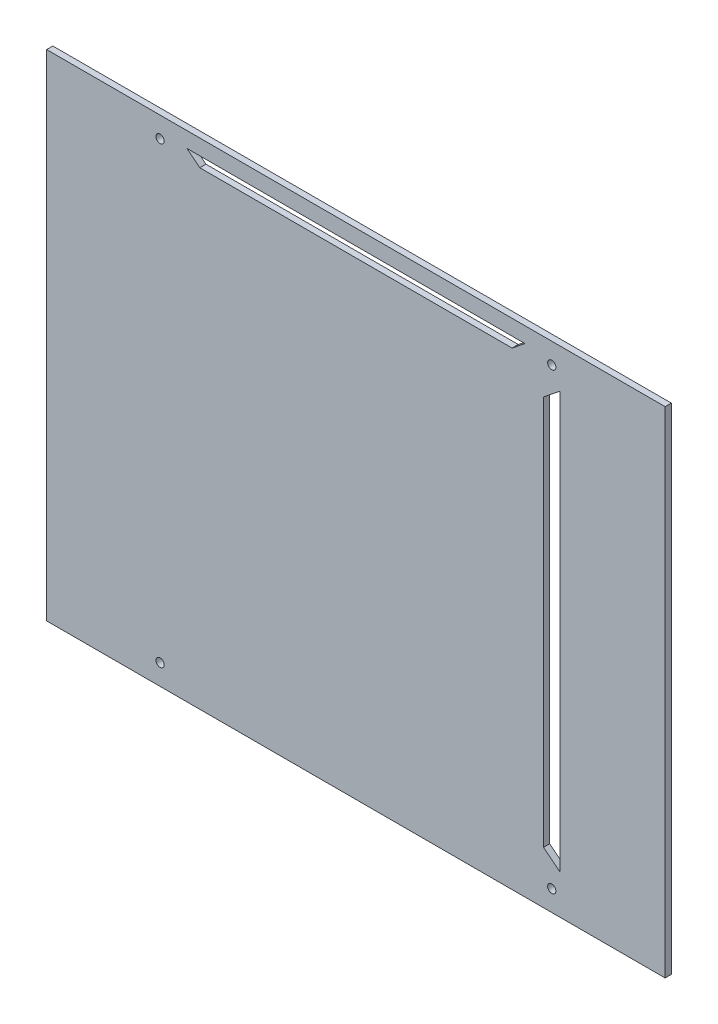
ISO-10303-21;
HEADER;
FILE_DESCRIPTION(('STEP AP214'),'2;1');
FILE_NAME('part.step','',(''),(''),'','','');
FILE_SCHEMA(('AUTOMOTIVE_DESIGN { 1 0 10303 214 1 1 1 1 }'));
ENDSEC;
DATA;
#1=APPLICATION_CONTEXT('core data for automotive mechanical design processes');
#2=APPLICATION_PROTOCOL_DEFINITION('international standard','automotive_design',2000,#1);
#3=PRODUCT_CONTEXT('',#1,'mechanical');
#4=PRODUCT('Part','Part','',(#3));
#5=PRODUCT_RELATED_PRODUCT_CATEGORY('part','',(#4));
#6=PRODUCT_DEFINITION_FORMATION('','',#4);
#7=PRODUCT_DEFINITION_CONTEXT('part definition',#1,'design');
#8=PRODUCT_DEFINITION('design','',#6,#7);
#9=PRODUCT_DEFINITION_SHAPE('','',#8);
#10=(LENGTH_UNIT() NAMED_UNIT(*) SI_UNIT(.MILLI.,.METRE.));
#11=(NAMED_UNIT(*) PLANE_ANGLE_UNIT() SI_UNIT($,.RADIAN.));
#12=(NAMED_UNIT(*) SI_UNIT($,.STERADIAN.) SOLID_ANGLE_UNIT());
#13=UNCERTAINTY_MEASURE_WITH_UNIT(LENGTH_MEASURE(1.E-05),#10,'distance_accuracy_value','');
#14=(GEOMETRIC_REPRESENTATION_CONTEXT(3) GLOBAL_UNCERTAINTY_ASSIGNED_CONTEXT((#13)) GLOBAL_UNIT_ASSIGNED_CONTEXT((#10,
#11,#12)) REPRESENTATION_CONTEXT('',''));
#15=CARTESIAN_POINT('',(0.,0.,0.));
#16=DIRECTION('',(0.,0.,1.));
#17=DIRECTION('',(1.,0.,0.));
#18=AXIS2_PLACEMENT_3D('',#15,#16,#17);
#19=CARTESIAN_POINT('',(0.,0.,3.));
#20=DIRECTION('',(0.,0.,1.));
#21=DIRECTION('',(1.,0.,0.));
#22=AXIS2_PLACEMENT_3D('',#19,#20,#21);
#23=PLANE('',#22);
#24=CARTESIAN_POINT('',(95.,-110.,3.));
#25=DIRECTION('',(0.,0.,1.));
#26=DIRECTION('',(-1.,0.,0.));
#27=AXIS2_PLACEMENT_3D('',#24,#25,#26);
#28=CIRCLE('',#27,2.00000000000001);
#29=CARTESIAN_POINT('',(93.,-110.,3.));
#30=VERTEX_POINT('',#29);
#31=EDGE_CURVE('E236',#30,#30,#28,.T.);
#32=ORIENTED_EDGE('',*,*,#31,.F.);
#33=EDGE_LOOP('',(#32));
#34=FACE_BOUND('',#33,.T.);
#35=CARTESIAN_POINT('',(-95.0000000000001,110.,3.));
#36=DIRECTION('',(0.,0.,1.));
#37=DIRECTION('',(1.,0.,0.));
#38=AXIS2_PLACEMENT_3D('',#35,#36,#37);
#39=CIRCLE('',#38,2.00000000000001);
#40=CARTESIAN_POINT('',(-93.,110.,3.));
#41=VERTEX_POINT('',#40);
#42=EDGE_CURVE('E249',#41,#41,#39,.T.);
#43=ORIENTED_EDGE('',*,*,#42,.F.);
#44=EDGE_LOOP('',(#43));
#45=FACE_BOUND('',#44,.T.);
#46=DIRECTION('',(0.,-1.,0.));
#47=VECTOR('',#46,1.);
#48=CARTESIAN_POINT('',(-150.,-120.,3.));
#49=LINE('',#48,#47);
#50=CARTESIAN_POINT('',(-150.,120.,3.));
#51=VERTEX_POINT('',#50);
#52=CARTESIAN_POINT('',(-150.,-120.,3.));
#53=VERTEX_POINT('',#52);
#54=EDGE_CURVE('E257',#51,#53,#49,.T.);
#55=ORIENTED_EDGE('',*,*,#54,.T.);
#56=DIRECTION('',(1.,0.,0.));
#57=VECTOR('',#56,1.);
#58=CARTESIAN_POINT('',(150.,-120.,3.));
#59=LINE('',#58,#57);
#60=CARTESIAN_POINT('',(150.,-120.,3.));
#61=VERTEX_POINT('',#60);
#62=EDGE_CURVE('E261',#53,#61,#59,.T.);
#63=ORIENTED_EDGE('',*,*,#62,.T.);
#64=DIRECTION('',(0.,1.,0.));
#65=VECTOR('',#64,1.);
#66=CARTESIAN_POINT('',(150.,-120.,3.));
#67=LINE('',#66,#65);
#68=CARTESIAN_POINT('',(150.,120.,3.));
#69=VERTEX_POINT('',#68);
#70=EDGE_CURVE('E265',#61,#69,#67,.T.);
#71=ORIENTED_EDGE('',*,*,#70,.T.);
#72=DIRECTION('',(-1.,0.,0.));
#73=VECTOR('',#72,1.);
#74=CARTESIAN_POINT('',(150.,120.,3.));
#75=LINE('',#74,#73);
#76=EDGE_CURVE('E268',#69,#51,#75,.T.);
#77=ORIENTED_EDGE('',*,*,#76,.T.);
#78=EDGE_LOOP('',(#55,#63,#71,#77));
#79=FACE_BOUND('',#78,.T.);
#80=CARTESIAN_POINT('',(94.9999999999999,110.,3.));
#81=DIRECTION('',(0.,0.,1.));
#82=DIRECTION('',(1.,0.,0.));
#83=AXIS2_PLACEMENT_3D('',#80,#81,#82);
#84=CIRCLE('',#83,2.00000000000001);
#85=CARTESIAN_POINT('',(97.,110.,3.));
#86=VERTEX_POINT('',#85);
#87=EDGE_CURVE('E242',#86,#86,#84,.T.);
#88=ORIENTED_EDGE('',*,*,#87,.F.);
#89=EDGE_LOOP('',(#88));
#90=FACE_BOUND('',#89,.T.);
#91=CARTESIAN_POINT('',(-95.,-110.,3.));
#92=DIRECTION('',(0.,0.,1.));
#93=DIRECTION('',(-1.,0.,0.));
#94=AXIS2_PLACEMENT_3D('',#91,#92,#93);
#95=CIRCLE('',#94,2.00000000000001);
#96=CARTESIAN_POINT('',(-97.,-110.,3.));
#97=VERTEX_POINT('',#96);
#98=EDGE_CURVE('E230',#97,#97,#95,.T.);
#99=ORIENTED_EDGE('',*,*,#98,.F.);
#100=EDGE_LOOP('',(#99));
#101=FACE_BOUND('',#100,.T.);
#102=DIRECTION('',(0.,-1.,0.));
#103=VECTOR('',#102,1.);
#104=CARTESIAN_POINT('',(90.9999999999999,94.6,3.));
#105=LINE('',#104,#103);
#106=CARTESIAN_POINT('',(90.9999999999999,94.6,3.));
#107=VERTEX_POINT('',#106);
#108=CARTESIAN_POINT('',(91.,-94.6,3.));
#109=VERTEX_POINT('',#108);
#110=EDGE_CURVE('E191',#107,#109,#105,.T.);
#111=ORIENTED_EDGE('',*,*,#110,.F.);
#112=DIRECTION('',(-0.78086880944303,-0.624695047554425,0.));
#113=VECTOR('',#112,1.);
#114=CARTESIAN_POINT('',(98.9999999999999,101.,3.));
#115=LINE('',#114,#113);
#116=CARTESIAN_POINT('',(98.9999999999999,101.,3.));
#117=VERTEX_POINT('',#116);
#118=EDGE_CURVE('E188',#117,#107,#115,.T.);
#119=ORIENTED_EDGE('',*,*,#118,.F.);
#120=DIRECTION('',(0.,1.,0.));
#121=VECTOR('',#120,1.);
#122=CARTESIAN_POINT('',(98.9999999999999,101.,3.));
#123=LINE('',#122,#121);
#124=CARTESIAN_POINT('',(99.,-101.,3.));
#125=VERTEX_POINT('',#124);
#126=EDGE_CURVE('E199',#125,#117,#123,.T.);
#127=ORIENTED_EDGE('',*,*,#126,.F.);
#128=DIRECTION('',(0.78086880944303,-0.624695047554425,0.));
#129=VECTOR('',#128,1.);
#130=CARTESIAN_POINT('',(99.,-101.,3.));
#131=LINE('',#130,#129);
#132=EDGE_CURVE('E195',#109,#125,#131,.T.);
#133=ORIENTED_EDGE('',*,*,#132,.F.);
#134=EDGE_LOOP('',(#111,#119,#127,#133));
#135=FACE_BOUND('',#134,.T.);
#136=DIRECTION('',(1.,0.,0.));
#137=VECTOR('',#136,1.);
#138=CARTESIAN_POINT('',(75.7499999999999,107.5,3.));
#139=LINE('',#138,#137);
#140=CARTESIAN_POINT('',(-75.7500000000001,107.5,3.));
#141=VERTEX_POINT('',#140);
#142=CARTESIAN_POINT('',(75.7499999999999,107.5,3.));
#143=VERTEX_POINT('',#142);
#144=EDGE_CURVE('E153',#141,#143,#139,.T.);
#145=ORIENTED_EDGE('',*,*,#144,.F.);
#146=DIRECTION('',(0.78086880944303,-0.624695047554425,0.));
#147=VECTOR('',#146,1.);
#148=CARTESIAN_POINT('',(-82.0000000000001,112.5,3.));
#149=LINE('',#148,#147);
#150=CARTESIAN_POINT('',(-82.0000000000001,112.5,3.));
#151=VERTEX_POINT('',#150);
#152=EDGE_CURVE('E144',#151,#141,#149,.T.);
#153=ORIENTED_EDGE('',*,*,#152,.F.);
#154=DIRECTION('',(-1.,0.,0.));
#155=VECTOR('',#154,1.);
#156=CARTESIAN_POINT('',(81.9999999999999,112.5,3.));
#157=LINE('',#156,#155);
#158=CARTESIAN_POINT('',(81.9999999999999,112.5,3.));
#159=VERTEX_POINT('',#158);
#160=EDGE_CURVE('E170',#159,#151,#157,.T.);
#161=ORIENTED_EDGE('',*,*,#160,.F.);
#162=DIRECTION('',(0.78086880944303,0.624695047554424,0.));
#163=VECTOR('',#162,1.);
#164=CARTESIAN_POINT('',(81.9999999999999,112.5,3.));
#165=LINE('',#164,#163);
#166=EDGE_CURVE('E166',#143,#159,#165,.T.);
#167=ORIENTED_EDGE('',*,*,#166,.F.);
#168=EDGE_LOOP('',(#145,#153,#161,#167));
#169=FACE_BOUND('',#168,.T.);
#170=ADVANCED_FACE('F42',(#34,#45,#79,#90,#101,#135,#169),#23,.T.);
#171=CARTESIAN_POINT('',(0.,0.,0.));
#172=DIRECTION('',(0.,0.,1.));
#173=DIRECTION('',(1.,0.,0.));
#174=AXIS2_PLACEMENT_3D('',#171,#172,#173);
#175=PLANE('',#174);
#176=DIRECTION('',(-0.78086880944303,-0.624695047554425,0.));
#177=VECTOR('',#176,1.);
#178=CARTESIAN_POINT('',(98.9999999999999,101.,0.));
#179=LINE('',#178,#177);
#180=CARTESIAN_POINT('',(98.9999999999999,101.,0.));
#181=VERTEX_POINT('',#180);
#182=CARTESIAN_POINT('',(90.9999999999999,94.6,0.));
#183=VERTEX_POINT('',#182);
#184=EDGE_CURVE('E162',#181,#183,#179,.T.);
#185=ORIENTED_EDGE('',*,*,#184,.T.);
#186=DIRECTION('',(0.,-1.,0.));
#187=VECTOR('',#186,1.);
#188=CARTESIAN_POINT('',(90.9999999999999,94.6,0.));
#189=LINE('',#188,#187);
#190=CARTESIAN_POINT('',(91.,-94.6,0.));
#191=VERTEX_POINT('',#190);
#192=EDGE_CURVE('E206',#183,#191,#189,.T.);
#193=ORIENTED_EDGE('',*,*,#192,.T.);
#194=DIRECTION('',(0.78086880944303,-0.624695047554425,0.));
#195=VECTOR('',#194,1.);
#196=CARTESIAN_POINT('',(99.,-101.,0.));
#197=LINE('',#196,#195);
#198=CARTESIAN_POINT('',(99.,-101.,0.));
#199=VERTEX_POINT('',#198);
#200=EDGE_CURVE('E210',#191,#199,#197,.T.);
#201=ORIENTED_EDGE('',*,*,#200,.T.);
#202=DIRECTION('',(0.,1.,0.));
#203=VECTOR('',#202,1.);
#204=CARTESIAN_POINT('',(98.9999999999999,101.,0.));
#205=LINE('',#204,#203);
#206=EDGE_CURVE('E192',#199,#181,#205,.T.);
#207=ORIENTED_EDGE('',*,*,#206,.T.);
#208=EDGE_LOOP('',(#185,#193,#201,#207));
#209=FACE_BOUND('',#208,.T.);
#210=DIRECTION('',(0.,-1.,0.));
#211=VECTOR('',#210,1.);
#212=CARTESIAN_POINT('',(-150.,-120.,0.));
#213=LINE('',#212,#211);
#214=CARTESIAN_POINT('',(-150.,120.,0.));
#215=VERTEX_POINT('',#214);
#216=CARTESIAN_POINT('',(-150.,-120.,0.));
#217=VERTEX_POINT('',#216);
#218=EDGE_CURVE('E253',#215,#217,#213,.T.);
#219=ORIENTED_EDGE('',*,*,#218,.F.);
#220=DIRECTION('',(-1.,0.,0.));
#221=VECTOR('',#220,1.);
#222=CARTESIAN_POINT('',(150.,120.,0.));
#223=LINE('',#222,#221);
#224=CARTESIAN_POINT('',(150.,120.,0.));
#225=VERTEX_POINT('',#224);
#226=EDGE_CURVE('E262',#225,#215,#223,.T.);
#227=ORIENTED_EDGE('',*,*,#226,.F.);
#228=DIRECTION('',(0.,1.,0.));
#229=VECTOR('',#228,1.);
#230=CARTESIAN_POINT('',(150.,-120.,0.));
#231=LINE('',#230,#229);
#232=CARTESIAN_POINT('',(150.,-120.,0.));
#233=VERTEX_POINT('',#232);
#234=EDGE_CURVE('E278',#233,#225,#231,.T.);
#235=ORIENTED_EDGE('',*,*,#234,.F.);
#236=DIRECTION('',(1.,0.,0.));
#237=VECTOR('',#236,1.);
#238=CARTESIAN_POINT('',(150.,-120.,0.));
#239=LINE('',#238,#237);
#240=EDGE_CURVE('E275',#217,#233,#239,.T.);
#241=ORIENTED_EDGE('',*,*,#240,.F.);
#242=EDGE_LOOP('',(#219,#227,#235,#241));
#243=FACE_BOUND('',#242,.T.);
#244=CARTESIAN_POINT('',(-95.0000000000001,110.,0.));
#245=DIRECTION('',(0.,0.,1.));
#246=DIRECTION('',(1.,0.,0.));
#247=AXIS2_PLACEMENT_3D('',#244,#245,#246);
#248=CIRCLE('',#247,2.00000000000001);
#249=CARTESIAN_POINT('',(-93.,110.,0.));
#250=VERTEX_POINT('',#249);
#251=EDGE_CURVE('E246',#250,#250,#248,.T.);
#252=ORIENTED_EDGE('',*,*,#251,.T.);
#253=EDGE_LOOP('',(#252));
#254=FACE_BOUND('',#253,.T.);
#255=CARTESIAN_POINT('',(94.9999999999999,110.,0.));
#256=DIRECTION('',(0.,0.,1.));
#257=DIRECTION('',(1.,0.,0.));
#258=AXIS2_PLACEMENT_3D('',#255,#256,#257);
#259=CIRCLE('',#258,2.00000000000001);
#260=CARTESIAN_POINT('',(97.,110.,0.));
#261=VERTEX_POINT('',#260);
#262=EDGE_CURVE('E239',#261,#261,#259,.T.);
#263=ORIENTED_EDGE('',*,*,#262,.T.);
#264=EDGE_LOOP('',(#263));
#265=FACE_BOUND('',#264,.T.);
#266=CARTESIAN_POINT('',(95.,-110.,0.));
#267=DIRECTION('',(0.,0.,1.));
#268=DIRECTION('',(-1.,0.,0.));
#269=AXIS2_PLACEMENT_3D('',#266,#267,#268);
#270=CIRCLE('',#269,2.00000000000001);
#271=CARTESIAN_POINT('',(93.,-110.,0.));
#272=VERTEX_POINT('',#271);
#273=EDGE_CURVE('E233',#272,#272,#270,.T.);
#274=ORIENTED_EDGE('',*,*,#273,.T.);
#275=EDGE_LOOP('',(#274));
#276=FACE_BOUND('',#275,.T.);
#277=CARTESIAN_POINT('',(-95.,-110.,0.));
#278=DIRECTION('',(0.,0.,1.));
#279=DIRECTION('',(-1.,0.,0.));
#280=AXIS2_PLACEMENT_3D('',#277,#278,#279);
#281=CIRCLE('',#280,2.00000000000001);
#282=CARTESIAN_POINT('',(-97.,-110.,0.));
#283=VERTEX_POINT('',#282);
#284=EDGE_CURVE('E229',#283,#283,#281,.T.);
#285=ORIENTED_EDGE('',*,*,#284,.T.);
#286=EDGE_LOOP('',(#285));
#287=FACE_BOUND('',#286,.T.);
#288=DIRECTION('',(0.78086880944303,-0.624695047554425,0.));
#289=VECTOR('',#288,1.);
#290=CARTESIAN_POINT('',(-82.0000000000001,112.5,0.));
#291=LINE('',#290,#289);
#292=CARTESIAN_POINT('',(-82.0000000000001,112.5,0.));
#293=VERTEX_POINT('',#292);
#294=CARTESIAN_POINT('',(-75.7500000000001,107.5,0.));
#295=VERTEX_POINT('',#294);
#296=EDGE_CURVE('E67',#293,#295,#291,.T.);
#297=ORIENTED_EDGE('',*,*,#296,.T.);
#298=DIRECTION('',(1.,0.,0.));
#299=VECTOR('',#298,1.);
#300=CARTESIAN_POINT('',(75.7499999999999,107.5,0.));
#301=LINE('',#300,#299);
#302=CARTESIAN_POINT('',(75.7499999999999,107.5,0.));
#303=VERTEX_POINT('',#302);
#304=EDGE_CURVE('E160',#295,#303,#301,.T.);
#305=ORIENTED_EDGE('',*,*,#304,.T.);
#306=DIRECTION('',(0.78086880944303,0.624695047554424,0.));
#307=VECTOR('',#306,1.);
#308=CARTESIAN_POINT('',(81.9999999999999,112.5,0.));
#309=LINE('',#308,#307);
#310=CARTESIAN_POINT('',(81.9999999999999,112.5,0.));
#311=VERTEX_POINT('',#310);
#312=EDGE_CURVE('E178',#303,#311,#309,.T.);
#313=ORIENTED_EDGE('',*,*,#312,.T.);
#314=DIRECTION('',(-1.,0.,0.));
#315=VECTOR('',#314,1.);
#316=CARTESIAN_POINT('',(81.9999999999999,112.5,0.));
#317=LINE('',#316,#315);
#318=EDGE_CURVE('E154',#311,#293,#317,.T.);
#319=ORIENTED_EDGE('',*,*,#318,.T.);
#320=EDGE_LOOP('',(#297,#305,#313,#319));
#321=FACE_BOUND('',#320,.T.);
#322=ADVANCED_FACE('F300',(#209,#243,#254,#265,#276,#287,#321),#175,.F.);
#323=CARTESIAN_POINT('',(-150.,-120.,3.));
#324=DIRECTION('',(1.,0.,0.));
#325=DIRECTION('',(0.,0.,-1.));
#326=AXIS2_PLACEMENT_3D('',#323,#324,#325);
#327=PLANE('',#326);
#328=ORIENTED_EDGE('',*,*,#218,.T.);
#329=DIRECTION('',(0.,0.,-1.));
#330=VECTOR('',#329,1.);
#331=CARTESIAN_POINT('',(-150.,-120.,3.));
#332=LINE('',#331,#330);
#333=EDGE_CURVE('E11',#53,#217,#332,.T.);
#334=ORIENTED_EDGE('',*,*,#333,.F.);
#335=ORIENTED_EDGE('',*,*,#54,.F.);
#336=DIRECTION('',(0.,0.,-1.));
#337=VECTOR('',#336,1.);
#338=CARTESIAN_POINT('',(-150.,120.,3.));
#339=LINE('',#338,#337);
#340=EDGE_CURVE('E271',#51,#215,#339,.T.);
#341=ORIENTED_EDGE('',*,*,#340,.T.);
#342=EDGE_LOOP('',(#328,#334,#335,#341));
#343=FACE_BOUND('',#342,.T.);
#344=ADVANCED_FACE('F44',(#343),#327,.F.);
#345=CARTESIAN_POINT('',(150.,-120.,3.));
#346=DIRECTION('',(0.,1.,0.));
#347=DIRECTION('',(0.,0.,1.));
#348=AXIS2_PLACEMENT_3D('',#345,#346,#347);
#349=PLANE('',#348);
#350=ORIENTED_EDGE('',*,*,#240,.T.);
#351=DIRECTION('',(0.,0.,-1.));
#352=VECTOR('',#351,1.);
#353=CARTESIAN_POINT('',(150.,-120.,3.));
#354=LINE('',#353,#352);
#355=EDGE_CURVE('E50',#61,#233,#354,.T.);
#356=ORIENTED_EDGE('',*,*,#355,.F.);
#357=ORIENTED_EDGE('',*,*,#62,.F.);
#358=ORIENTED_EDGE('',*,*,#333,.T.);
#359=EDGE_LOOP('',(#350,#356,#357,#358));
#360=FACE_BOUND('',#359,.T.);
#361=ADVANCED_FACE('F311',(#360),#349,.F.);
#362=CARTESIAN_POINT('',(150.,-120.,3.));
#363=DIRECTION('',(-1.,0.,0.));
#364=DIRECTION('',(0.,0.,1.));
#365=AXIS2_PLACEMENT_3D('',#362,#363,#364);
#366=PLANE('',#365);
#367=ORIENTED_EDGE('',*,*,#234,.T.);
#368=DIRECTION('',(0.,0.,-1.));
#369=VECTOR('',#368,1.);
#370=CARTESIAN_POINT('',(150.,120.,3.));
#371=LINE('',#370,#369);
#372=EDGE_CURVE('E285',#69,#225,#371,.T.);
#373=ORIENTED_EDGE('',*,*,#372,.F.);
#374=ORIENTED_EDGE('',*,*,#70,.F.);
#375=ORIENTED_EDGE('',*,*,#355,.T.);
#376=EDGE_LOOP('',(#367,#373,#374,#375));
#377=FACE_BOUND('',#376,.T.);
#378=ADVANCED_FACE('F294',(#377),#366,.F.);
#379=CARTESIAN_POINT('',(150.,120.,3.));
#380=DIRECTION('',(0.,-1.,0.));
#381=DIRECTION('',(0.,0.,-1.));
#382=AXIS2_PLACEMENT_3D('',#379,#380,#381);
#383=PLANE('',#382);
#384=ORIENTED_EDGE('',*,*,#226,.T.);
#385=ORIENTED_EDGE('',*,*,#340,.F.);
#386=ORIENTED_EDGE('',*,*,#76,.F.);
#387=ORIENTED_EDGE('',*,*,#372,.T.);
#388=EDGE_LOOP('',(#384,#385,#386,#387));
#389=FACE_BOUND('',#388,.T.);
#390=ADVANCED_FACE('F304',(#389),#383,.F.);
#391=CARTESIAN_POINT('',(-95.0000000000001,110.,3.));
#392=DIRECTION('',(0.,0.,-1.));
#393=DIRECTION('',(-1.,0.,0.));
#394=AXIS2_PLACEMENT_3D('',#391,#392,#393);
#395=CYLINDRICAL_SURFACE('',#394,2.00000000000001);
#396=ORIENTED_EDGE('',*,*,#42,.T.);
#397=EDGE_LOOP('',(#396));
#398=FACE_BOUND('',#397,.T.);
#399=ORIENTED_EDGE('',*,*,#251,.F.);
#400=EDGE_LOOP('',(#399));
#401=FACE_BOUND('',#400,.T.);
#402=ADVANCED_FACE('F329',(#398,#401),#395,.F.);
#403=CARTESIAN_POINT('',(94.9999999999999,110.,3.));
#404=DIRECTION('',(0.,0.,-1.));
#405=DIRECTION('',(-1.,0.,0.));
#406=AXIS2_PLACEMENT_3D('',#403,#404,#405);
#407=CYLINDRICAL_SURFACE('',#406,2.00000000000001);
#408=ORIENTED_EDGE('',*,*,#87,.T.);
#409=EDGE_LOOP('',(#408));
#410=FACE_BOUND('',#409,.T.);
#411=ORIENTED_EDGE('',*,*,#262,.F.);
#412=EDGE_LOOP('',(#411));
#413=FACE_BOUND('',#412,.T.);
#414=ADVANCED_FACE('F336',(#410,#413),#407,.F.);
#415=CARTESIAN_POINT('',(95.,-110.,3.));
#416=DIRECTION('',(0.,0.,-1.));
#417=DIRECTION('',(-1.,0.,0.));
#418=AXIS2_PLACEMENT_3D('',#415,#416,#417);
#419=CYLINDRICAL_SURFACE('',#418,2.00000000000001);
#420=ORIENTED_EDGE('',*,*,#31,.T.);
#421=EDGE_LOOP('',(#420));
#422=FACE_BOUND('',#421,.T.);
#423=ORIENTED_EDGE('',*,*,#273,.F.);
#424=EDGE_LOOP('',(#423));
#425=FACE_BOUND('',#424,.T.);
#426=ADVANCED_FACE('F341',(#422,#425),#419,.F.);
#427=CARTESIAN_POINT('',(-95.,-110.,3.));
#428=DIRECTION('',(0.,0.,-1.));
#429=DIRECTION('',(-1.,0.,0.));
#430=AXIS2_PLACEMENT_3D('',#427,#428,#429);
#431=CYLINDRICAL_SURFACE('',#430,2.00000000000001);
#432=ORIENTED_EDGE('',*,*,#98,.T.);
#433=EDGE_LOOP('',(#432));
#434=FACE_BOUND('',#433,.T.);
#435=ORIENTED_EDGE('',*,*,#284,.F.);
#436=EDGE_LOOP('',(#435));
#437=FACE_BOUND('',#436,.T.);
#438=ADVANCED_FACE('F383',(#434,#437),#431,.F.);
#439=CARTESIAN_POINT('',(98.9999999999999,101.,3.));
#440=DIRECTION('',(0.624695047554425,-0.78086880944303,0.));
#441=DIRECTION('',(0.78086880944303,0.624695047554425,0.));
#442=AXIS2_PLACEMENT_3D('',#439,#440,#441);
#443=PLANE('',#442);
#444=ORIENTED_EDGE('',*,*,#184,.F.);
#445=DIRECTION('',(0.,0.,-1.));
#446=VECTOR('',#445,1.);
#447=CARTESIAN_POINT('',(98.9999999999999,101.,3.));
#448=LINE('',#447,#446);
#449=EDGE_CURVE('E202',#117,#181,#448,.T.);
#450=ORIENTED_EDGE('',*,*,#449,.F.);
#451=ORIENTED_EDGE('',*,*,#118,.T.);
#452=DIRECTION('',(0.,0.,-1.));
#453=VECTOR('',#452,1.);
#454=CARTESIAN_POINT('',(90.9999999999999,94.6,3.));
#455=LINE('',#454,#453);
#456=EDGE_CURVE('E225',#107,#183,#455,.T.);
#457=ORIENTED_EDGE('',*,*,#456,.T.);
#458=EDGE_LOOP('',(#444,#450,#451,#457));
#459=FACE_BOUND('',#458,.T.);
#460=ADVANCED_FACE('F379',(#459),#443,.T.);
#461=CARTESIAN_POINT('',(90.9999999999999,94.6,3.));
#462=DIRECTION('',(1.,0.,0.));
#463=DIRECTION('',(0.,1.,0.));
#464=AXIS2_PLACEMENT_3D('',#461,#462,#463);
#465=PLANE('',#464);
#466=ORIENTED_EDGE('',*,*,#192,.F.);
#467=ORIENTED_EDGE('',*,*,#456,.F.);
#468=ORIENTED_EDGE('',*,*,#110,.T.);
#469=DIRECTION('',(0.,0.,-1.));
#470=VECTOR('',#469,1.);
#471=CARTESIAN_POINT('',(91.,-94.6,3.));
#472=LINE('',#471,#470);
#473=EDGE_CURVE('E222',#109,#191,#472,.T.);
#474=ORIENTED_EDGE('',*,*,#473,.T.);
#475=EDGE_LOOP('',(#466,#467,#468,#474));
#476=FACE_BOUND('',#475,.T.);
#477=ADVANCED_FACE('F375',(#476),#465,.T.);
#478=CARTESIAN_POINT('',(99.,-101.,3.));
#479=DIRECTION('',(0.624695047554425,0.78086880944303,0.));
#480=DIRECTION('',(-0.78086880944303,0.624695047554425,0.));
#481=AXIS2_PLACEMENT_3D('',#478,#479,#480);
#482=PLANE('',#481);
#483=ORIENTED_EDGE('',*,*,#200,.F.);
#484=ORIENTED_EDGE('',*,*,#473,.F.);
#485=ORIENTED_EDGE('',*,*,#132,.T.);
#486=DIRECTION('',(0.,0.,-1.));
#487=VECTOR('',#486,1.);
#488=CARTESIAN_POINT('',(99.,-101.,3.));
#489=LINE('',#488,#487);
#490=EDGE_CURVE('E220',#125,#199,#489,.T.);
#491=ORIENTED_EDGE('',*,*,#490,.T.);
#492=EDGE_LOOP('',(#483,#484,#485,#491));
#493=FACE_BOUND('',#492,.T.);
#494=ADVANCED_FACE('F371',(#493),#482,.T.);
#495=CARTESIAN_POINT('',(98.9999999999999,101.,3.));
#496=DIRECTION('',(-1.,0.,0.));
#497=DIRECTION('',(0.,-1.,0.));
#498=AXIS2_PLACEMENT_3D('',#495,#496,#497);
#499=PLANE('',#498);
#500=ORIENTED_EDGE('',*,*,#206,.F.);
#501=ORIENTED_EDGE('',*,*,#490,.F.);
#502=ORIENTED_EDGE('',*,*,#126,.T.);
#503=ORIENTED_EDGE('',*,*,#449,.T.);
#504=EDGE_LOOP('',(#500,#501,#502,#503));
#505=FACE_BOUND('',#504,.T.);
#506=ADVANCED_FACE('F368',(#505),#499,.T.);
#507=CARTESIAN_POINT('',(-82.0000000000001,112.5,3.));
#508=DIRECTION('',(0.624695047554425,0.78086880944303,0.));
#509=DIRECTION('',(-0.78086880944303,0.624695047554425,0.));
#510=AXIS2_PLACEMENT_3D('',#507,#508,#509);
#511=PLANE('',#510);
#512=ORIENTED_EDGE('',*,*,#296,.F.);
#513=DIRECTION('',(0.,0.,-1.));
#514=VECTOR('',#513,1.);
#515=CARTESIAN_POINT('',(-82.0000000000001,112.5,3.));
#516=LINE('',#515,#514);
#517=EDGE_CURVE('E148',#151,#293,#516,.T.);
#518=ORIENTED_EDGE('',*,*,#517,.F.);
#519=ORIENTED_EDGE('',*,*,#152,.T.);
#520=DIRECTION('',(0.,0.,-1.));
#521=VECTOR('',#520,1.);
#522=CARTESIAN_POINT('',(-75.7500000000001,107.5,3.));
#523=LINE('',#522,#521);
#524=EDGE_CURVE('E147',#141,#295,#523,.T.);
#525=ORIENTED_EDGE('',*,*,#524,.T.);
#526=EDGE_LOOP('',(#512,#518,#519,#525));
#527=FACE_BOUND('',#526,.T.);
#528=ADVANCED_FACE('F146',(#527),#511,.T.);
#529=CARTESIAN_POINT('',(75.7499999999999,107.5,3.));
#530=DIRECTION('',(0.,1.,0.));
#531=DIRECTION('',(0.,0.,1.));
#532=AXIS2_PLACEMENT_3D('',#529,#530,#531);
#533=PLANE('',#532);
#534=ORIENTED_EDGE('',*,*,#304,.F.);
#535=ORIENTED_EDGE('',*,*,#524,.F.);
#536=ORIENTED_EDGE('',*,*,#144,.T.);
#537=DIRECTION('',(0.,0.,-1.));
#538=VECTOR('',#537,1.);
#539=CARTESIAN_POINT('',(75.7499999999999,107.5,3.));
#540=LINE('',#539,#538);
#541=EDGE_CURVE('E163',#143,#303,#540,.T.);
#542=ORIENTED_EDGE('',*,*,#541,.T.);
#543=EDGE_LOOP('',(#534,#535,#536,#542));
#544=FACE_BOUND('',#543,.T.);
#545=ADVANCED_FACE('F157',(#544),#533,.T.);
#546=CARTESIAN_POINT('',(81.9999999999999,112.5,3.));
#547=DIRECTION('',(-0.624695047554424,0.78086880944303,0.));
#548=DIRECTION('',(-0.78086880944303,-0.624695047554424,0.));
#549=AXIS2_PLACEMENT_3D('',#546,#547,#548);
#550=PLANE('',#549);
#551=ORIENTED_EDGE('',*,*,#312,.F.);
#552=ORIENTED_EDGE('',*,*,#541,.F.);
#553=ORIENTED_EDGE('',*,*,#166,.T.);
#554=DIRECTION('',(0.,0.,-1.));
#555=VECTOR('',#554,1.);
#556=CARTESIAN_POINT('',(81.9999999999999,112.5,3.));
#557=LINE('',#556,#555);
#558=EDGE_CURVE('E57',#159,#311,#557,.T.);
#559=ORIENTED_EDGE('',*,*,#558,.T.);
#560=EDGE_LOOP('',(#551,#552,#553,#559));
#561=FACE_BOUND('',#560,.T.);
#562=ADVANCED_FACE('F356',(#561),#550,.T.);
#563=CARTESIAN_POINT('',(81.9999999999999,112.5,3.));
#564=DIRECTION('',(0.,-1.,0.));
#565=DIRECTION('',(0.,0.,-1.));
#566=AXIS2_PLACEMENT_3D('',#563,#564,#565);
#567=PLANE('',#566);
#568=ORIENTED_EDGE('',*,*,#318,.F.);
#569=ORIENTED_EDGE('',*,*,#558,.F.);
#570=ORIENTED_EDGE('',*,*,#160,.T.);
#571=ORIENTED_EDGE('',*,*,#517,.T.);
#572=EDGE_LOOP('',(#568,#569,#570,#571));
#573=FACE_BOUND('',#572,.T.);
#574=ADVANCED_FACE('F354',(#573),#567,.T.);
#575=CLOSED_SHELL('',(#170,#322,#344,#361,#378,#390,#402,#414,#426,#438,#460,#477,#494,#506,
#528,#545,#562,#574));
#576=MANIFOLD_SOLID_BREP('B2',#575);
#577=ADVANCED_BREP_SHAPE_REPRESENTATION('',(#18,#576),#14);
#578=SHAPE_DEFINITION_REPRESENTATION(#9,#577);
ENDSEC;
END-ISO-10303-21;
